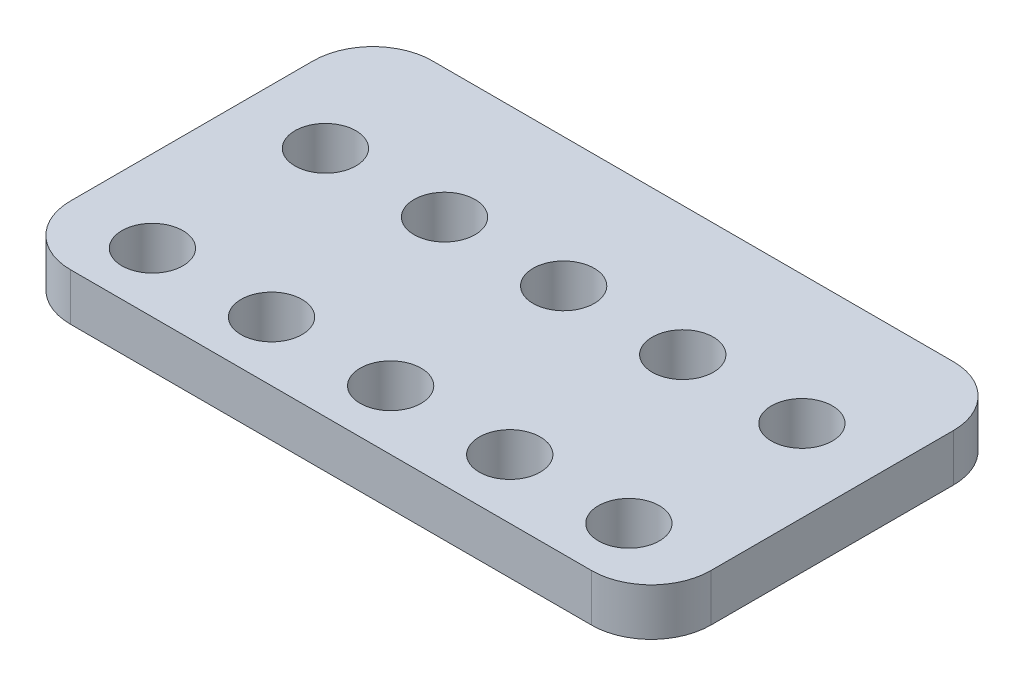
ISO-10303-21;
HEADER;
FILE_DESCRIPTION(('STEP AP214'),'2;1');
FILE_NAME('part.step','',(''),(''),'','','');
FILE_SCHEMA(('AUTOMOTIVE_DESIGN { 1 0 10303 214 1 1 1 1 }'));
ENDSEC;
DATA;
#1=APPLICATION_CONTEXT('core data for automotive mechanical design processes');
#2=APPLICATION_PROTOCOL_DEFINITION('international standard','automotive_design',2000,#1);
#3=PRODUCT_CONTEXT('',#1,'mechanical');
#4=PRODUCT('Part','Part','',(#3));
#5=PRODUCT_RELATED_PRODUCT_CATEGORY('part','',(#4));
#6=PRODUCT_DEFINITION_FORMATION('','',#4);
#7=PRODUCT_DEFINITION_CONTEXT('part definition',#1,'design');
#8=PRODUCT_DEFINITION('design','',#6,#7);
#9=PRODUCT_DEFINITION_SHAPE('','',#8);
#10=(LENGTH_UNIT() NAMED_UNIT(*) SI_UNIT(.MILLI.,.METRE.));
#11=(NAMED_UNIT(*) PLANE_ANGLE_UNIT() SI_UNIT($,.RADIAN.));
#12=(NAMED_UNIT(*) SI_UNIT($,.STERADIAN.) SOLID_ANGLE_UNIT());
#13=UNCERTAINTY_MEASURE_WITH_UNIT(LENGTH_MEASURE(1.E-05),#10,'distance_accuracy_value','');
#14=(GEOMETRIC_REPRESENTATION_CONTEXT(3) GLOBAL_UNCERTAINTY_ASSIGNED_CONTEXT((#13)) GLOBAL_UNIT_ASSIGNED_CONTEXT((#10,
#11,#12)) REPRESENTATION_CONTEXT('',''));
#15=CARTESIAN_POINT('',(0.,0.,0.));
#16=DIRECTION('',(0.,0.,1.));
#17=DIRECTION('',(1.,0.,0.));
#18=AXIS2_PLACEMENT_3D('',#15,#16,#17);
#19=CARTESIAN_POINT('',(0.,3.175,0.));
#20=DIRECTION('',(0.,1.,0.));
#21=DIRECTION('',(0.,0.,1.));
#22=AXIS2_PLACEMENT_3D('',#19,#20,#21);
#23=PLANE('',#22);
#24=CARTESIAN_POINT('',(7.99999999999999,3.175,-3.47));
#25=DIRECTION('',(0.,1.,0.));
#26=DIRECTION('',(0.,0.,1.));
#27=AXIS2_PLACEMENT_3D('',#24,#25,#26);
#28=CIRCLE('',#27,2.05);
#29=CARTESIAN_POINT('',(7.99999999999999,3.175,-1.42));
#30=VERTEX_POINT('',#29);
#31=EDGE_CURVE('E222',#30,#30,#28,.T.);
#32=ORIENTED_EDGE('',*,*,#31,.F.);
#33=EDGE_LOOP('',(#32));
#34=FACE_BOUND('',#33,.T.);
#35=CARTESIAN_POINT('',(-8.00000000000001,3.175,-3.47));
#36=DIRECTION('',(0.,1.,0.));
#37=DIRECTION('',(0.,0.,1.));
#38=AXIS2_PLACEMENT_3D('',#35,#36,#37);
#39=CIRCLE('',#38,2.05);
#40=CARTESIAN_POINT('',(-8.00000000000001,3.175,-1.42));
#41=VERTEX_POINT('',#40);
#42=EDGE_CURVE('E210',#41,#41,#39,.T.);
#43=ORIENTED_EDGE('',*,*,#42,.F.);
#44=EDGE_LOOP('',(#43));
#45=FACE_BOUND('',#44,.T.);
#46=CARTESIAN_POINT('',(16.,3.175,8.15));
#47=DIRECTION('',(0.,1.,0.));
#48=DIRECTION('',(0.,0.,1.));
#49=AXIS2_PLACEMENT_3D('',#46,#47,#48);
#50=CIRCLE('',#49,2.05);
#51=CARTESIAN_POINT('',(16.,3.175,10.2));
#52=VERTEX_POINT('',#51);
#53=EDGE_CURVE('E198',#52,#52,#50,.T.);
#54=ORIENTED_EDGE('',*,*,#53,.F.);
#55=EDGE_LOOP('',(#54));
#56=FACE_BOUND('',#55,.T.);
#57=CARTESIAN_POINT('',(0.,3.175,8.15));
#58=DIRECTION('',(0.,1.,0.));
#59=DIRECTION('',(0.,0.,1.));
#60=AXIS2_PLACEMENT_3D('',#57,#58,#59);
#61=CIRCLE('',#60,2.05);
#62=CARTESIAN_POINT('',(0.,3.175,10.2));
#63=VERTEX_POINT('',#62);
#64=EDGE_CURVE('E186',#63,#63,#61,.T.);
#65=ORIENTED_EDGE('',*,*,#64,.F.);
#66=EDGE_LOOP('',(#65));
#67=FACE_BOUND('',#66,.T.);
#68=CARTESIAN_POINT('',(-16.,3.175,8.15));
#69=DIRECTION('',(0.,1.,0.));
#70=DIRECTION('',(0.,0.,1.));
#71=AXIS2_PLACEMENT_3D('',#68,#69,#70);
#72=CIRCLE('',#71,2.05);
#73=CARTESIAN_POINT('',(-16.,3.175,10.2));
#74=VERTEX_POINT('',#73);
#75=EDGE_CURVE('E127',#74,#74,#72,.T.);
#76=ORIENTED_EDGE('',*,*,#75,.F.);
#77=EDGE_LOOP('',(#76));
#78=FACE_BOUND('',#77,.T.);
#79=DIRECTION('',(-1.,0.,0.));
#80=VECTOR('',#79,1.);
#81=CARTESIAN_POINT('',(21.5,3.175,-12.15));
#82=LINE('',#81,#80);
#83=CARTESIAN_POINT('',(17.5,3.175,-12.15));
#84=VERTEX_POINT('',#83);
#85=CARTESIAN_POINT('',(-17.5,3.175,-12.15));
#86=VERTEX_POINT('',#85);
#87=EDGE_CURVE('E136',#84,#86,#82,.T.);
#88=ORIENTED_EDGE('',*,*,#87,.T.);
#89=CARTESIAN_POINT('',(-17.5,3.175,-8.15));
#90=DIRECTION('',(0.,1.,0.));
#91=DIRECTION('',(0.,0.,1.));
#92=AXIS2_PLACEMENT_3D('',#89,#90,#91);
#93=CIRCLE('',#92,4.);
#94=CARTESIAN_POINT('',(-21.5,3.175,-8.15));
#95=VERTEX_POINT('',#94);
#96=EDGE_CURVE('E155',#86,#95,#93,.T.);
#97=ORIENTED_EDGE('',*,*,#96,.T.);
#98=DIRECTION('',(0.,0.,1.));
#99=VECTOR('',#98,1.);
#100=CARTESIAN_POINT('',(-21.5,3.175,12.15));
#101=LINE('',#100,#99);
#102=CARTESIAN_POINT('',(-21.5,3.175,8.15));
#103=VERTEX_POINT('',#102);
#104=EDGE_CURVE('E119',#95,#103,#101,.T.);
#105=ORIENTED_EDGE('',*,*,#104,.T.);
#106=CARTESIAN_POINT('',(-17.5,3.175,8.15));
#107=DIRECTION('',(0.,1.,0.));
#108=DIRECTION('',(0.,0.,1.));
#109=AXIS2_PLACEMENT_3D('',#106,#107,#108);
#110=CIRCLE('',#109,4.);
#111=CARTESIAN_POINT('',(-17.5,3.175,12.15));
#112=VERTEX_POINT('',#111);
#113=EDGE_CURVE('E150',#103,#112,#110,.T.);
#114=ORIENTED_EDGE('',*,*,#113,.T.);
#115=DIRECTION('',(1.,0.,0.));
#116=VECTOR('',#115,1.);
#117=CARTESIAN_POINT('',(21.5,3.175,12.15));
#118=LINE('',#117,#116);
#119=CARTESIAN_POINT('',(17.5,3.175,12.15));
#120=VERTEX_POINT('',#119);
#121=EDGE_CURVE('E166',#112,#120,#118,.T.);
#122=ORIENTED_EDGE('',*,*,#121,.T.);
#123=CARTESIAN_POINT('',(17.5,3.175,8.14999999999999));
#124=DIRECTION('',(0.,1.,0.));
#125=DIRECTION('',(0.,0.,1.));
#126=AXIS2_PLACEMENT_3D('',#123,#124,#125);
#127=CIRCLE('',#126,4.);
#128=CARTESIAN_POINT('',(21.5,3.175,8.14999999999999));
#129=VERTEX_POINT('',#128);
#130=EDGE_CURVE('E55',#120,#129,#127,.T.);
#131=ORIENTED_EDGE('',*,*,#130,.T.);
#132=DIRECTION('',(0.,0.,-1.));
#133=VECTOR('',#132,1.);
#134=CARTESIAN_POINT('',(21.5,3.175,12.15));
#135=LINE('',#134,#133);
#136=CARTESIAN_POINT('',(21.5,3.175,-8.15));
#137=VERTEX_POINT('',#136);
#138=EDGE_CURVE('E174',#129,#137,#135,.T.);
#139=ORIENTED_EDGE('',*,*,#138,.T.);
#140=CARTESIAN_POINT('',(17.5,3.175,-8.15));
#141=DIRECTION('',(0.,1.,0.));
#142=DIRECTION('',(0.,0.,1.));
#143=AXIS2_PLACEMENT_3D('',#140,#141,#142);
#144=CIRCLE('',#143,4.);
#145=EDGE_CURVE('E153',#137,#84,#144,.T.);
#146=ORIENTED_EDGE('',*,*,#145,.T.);
#147=EDGE_LOOP('',(#88,#97,#105,#114,#122,#131,#139,#146));
#148=FACE_BOUND('',#147,.T.);
#149=CARTESIAN_POINT('',(-8.00000000000001,3.175,8.15));
#150=DIRECTION('',(0.,1.,0.));
#151=DIRECTION('',(0.,0.,1.));
#152=AXIS2_PLACEMENT_3D('',#149,#150,#151);
#153=CIRCLE('',#152,2.05);
#154=CARTESIAN_POINT('',(-8.00000000000001,3.175,10.2));
#155=VERTEX_POINT('',#154);
#156=EDGE_CURVE('E181',#155,#155,#153,.T.);
#157=ORIENTED_EDGE('',*,*,#156,.F.);
#158=EDGE_LOOP('',(#157));
#159=FACE_BOUND('',#158,.T.);
#160=CARTESIAN_POINT('',(7.99999999999999,3.175,8.15));
#161=DIRECTION('',(0.,1.,0.));
#162=DIRECTION('',(0.,0.,1.));
#163=AXIS2_PLACEMENT_3D('',#160,#161,#162);
#164=CIRCLE('',#163,2.05);
#165=CARTESIAN_POINT('',(7.99999999999999,3.175,10.2));
#166=VERTEX_POINT('',#165);
#167=EDGE_CURVE('E192',#166,#166,#164,.T.);
#168=ORIENTED_EDGE('',*,*,#167,.F.);
#169=EDGE_LOOP('',(#168));
#170=FACE_BOUND('',#169,.T.);
#171=CARTESIAN_POINT('',(-16.,3.175,-3.47));
#172=DIRECTION('',(0.,1.,0.));
#173=DIRECTION('',(0.,0.,1.));
#174=AXIS2_PLACEMENT_3D('',#171,#172,#173);
#175=CIRCLE('',#174,2.05);
#176=CARTESIAN_POINT('',(-16.,3.175,-1.42));
#177=VERTEX_POINT('',#176);
#178=EDGE_CURVE('E204',#177,#177,#175,.T.);
#179=ORIENTED_EDGE('',*,*,#178,.F.);
#180=EDGE_LOOP('',(#179));
#181=FACE_BOUND('',#180,.T.);
#182=CARTESIAN_POINT('',(0.,3.175,-3.47));
#183=DIRECTION('',(0.,1.,0.));
#184=DIRECTION('',(0.,0.,1.));
#185=AXIS2_PLACEMENT_3D('',#182,#183,#184);
#186=CIRCLE('',#185,2.05);
#187=CARTESIAN_POINT('',(0.,3.175,-1.42));
#188=VERTEX_POINT('',#187);
#189=EDGE_CURVE('E216',#188,#188,#186,.T.);
#190=ORIENTED_EDGE('',*,*,#189,.F.);
#191=EDGE_LOOP('',(#190));
#192=FACE_BOUND('',#191,.T.);
#193=CARTESIAN_POINT('',(16.,3.175,-3.47));
#194=DIRECTION('',(0.,1.,0.));
#195=DIRECTION('',(0.,0.,1.));
#196=AXIS2_PLACEMENT_3D('',#193,#194,#195);
#197=CIRCLE('',#196,2.05);
#198=CARTESIAN_POINT('',(16.,3.175,-1.42));
#199=VERTEX_POINT('',#198);
#200=EDGE_CURVE('E228',#199,#199,#197,.T.);
#201=ORIENTED_EDGE('',*,*,#200,.F.);
#202=EDGE_LOOP('',(#201));
#203=FACE_BOUND('',#202,.T.);
#204=ADVANCED_FACE('F33',(#34,#45,#56,#67,#78,#148,#159,#170,#181,#192,#203),#23,.T.);
#205=CARTESIAN_POINT('',(0.,0.,0.));
#206=DIRECTION('',(0.,1.,0.));
#207=DIRECTION('',(0.,0.,1.));
#208=AXIS2_PLACEMENT_3D('',#205,#206,#207);
#209=PLANE('',#208);
#210=DIRECTION('',(0.,0.,1.));
#211=VECTOR('',#210,1.);
#212=CARTESIAN_POINT('',(-21.5,0.,12.15));
#213=LINE('',#212,#211);
#214=CARTESIAN_POINT('',(-21.5,0.,-8.15));
#215=VERTEX_POINT('',#214);
#216=CARTESIAN_POINT('',(-21.5,0.,8.15));
#217=VERTEX_POINT('',#216);
#218=EDGE_CURVE('E116',#215,#217,#213,.T.);
#219=ORIENTED_EDGE('',*,*,#218,.F.);
#220=CARTESIAN_POINT('',(-17.5,0.,-8.15));
#221=DIRECTION('',(0.,1.,0.));
#222=DIRECTION('',(0.,0.,1.));
#223=AXIS2_PLACEMENT_3D('',#220,#221,#222);
#224=CIRCLE('',#223,4.);
#225=CARTESIAN_POINT('',(-17.5,0.,-12.15));
#226=VERTEX_POINT('',#225);
#227=EDGE_CURVE('E99',#215,#226,#224,.F.);
#228=ORIENTED_EDGE('',*,*,#227,.T.);
#229=DIRECTION('',(-1.,0.,0.));
#230=VECTOR('',#229,1.);
#231=CARTESIAN_POINT('',(21.5,0.,-12.15));
#232=LINE('',#231,#230);
#233=CARTESIAN_POINT('',(17.5,0.,-12.15));
#234=VERTEX_POINT('',#233);
#235=EDGE_CURVE('E140',#234,#226,#232,.T.);
#236=ORIENTED_EDGE('',*,*,#235,.F.);
#237=CARTESIAN_POINT('',(17.5,0.,-8.15));
#238=DIRECTION('',(0.,1.,0.));
#239=DIRECTION('',(0.,0.,1.));
#240=AXIS2_PLACEMENT_3D('',#237,#238,#239);
#241=CIRCLE('',#240,4.);
#242=CARTESIAN_POINT('',(21.5,0.,-8.15));
#243=VERTEX_POINT('',#242);
#244=EDGE_CURVE('E110',#234,#243,#241,.F.);
#245=ORIENTED_EDGE('',*,*,#244,.T.);
#246=DIRECTION('',(0.,0.,-1.));
#247=VECTOR('',#246,1.);
#248=CARTESIAN_POINT('',(21.5,0.,12.15));
#249=LINE('',#248,#247);
#250=CARTESIAN_POINT('',(21.5,0.,8.14999999999999));
#251=VERTEX_POINT('',#250);
#252=EDGE_CURVE('E130',#251,#243,#249,.T.);
#253=ORIENTED_EDGE('',*,*,#252,.F.);
#254=CARTESIAN_POINT('',(17.5,0.,8.14999999999999));
#255=DIRECTION('',(0.,1.,0.));
#256=DIRECTION('',(0.,0.,1.));
#257=AXIS2_PLACEMENT_3D('',#254,#255,#256);
#258=CIRCLE('',#257,4.);
#259=CARTESIAN_POINT('',(17.5,0.,12.15));
#260=VERTEX_POINT('',#259);
#261=EDGE_CURVE('E144',#251,#260,#258,.F.);
#262=ORIENTED_EDGE('',*,*,#261,.T.);
#263=DIRECTION('',(1.,0.,0.));
#264=VECTOR('',#263,1.);
#265=CARTESIAN_POINT('',(21.5,0.,12.15));
#266=LINE('',#265,#264);
#267=CARTESIAN_POINT('',(-17.5,0.,12.15));
#268=VERTEX_POINT('',#267);
#269=EDGE_CURVE('E126',#268,#260,#266,.T.);
#270=ORIENTED_EDGE('',*,*,#269,.F.);
#271=CARTESIAN_POINT('',(-17.5,0.,8.15));
#272=DIRECTION('',(0.,1.,0.));
#273=DIRECTION('',(0.,0.,1.));
#274=AXIS2_PLACEMENT_3D('',#271,#272,#273);
#275=CIRCLE('',#274,4.);
#276=EDGE_CURVE('E120',#268,#217,#275,.F.);
#277=ORIENTED_EDGE('',*,*,#276,.T.);
#278=EDGE_LOOP('',(#219,#228,#236,#245,#253,#262,#270,#277));
#279=FACE_BOUND('',#278,.T.);
#280=CARTESIAN_POINT('',(-16.,0.,8.15));
#281=DIRECTION('',(0.,1.,0.));
#282=DIRECTION('',(0.,0.,1.));
#283=AXIS2_PLACEMENT_3D('',#280,#281,#282);
#284=CIRCLE('',#283,2.05);
#285=CARTESIAN_POINT('',(-16.,0.,10.2));
#286=VERTEX_POINT('',#285);
#287=EDGE_CURVE('E133',#286,#286,#284,.T.);
#288=ORIENTED_EDGE('',*,*,#287,.T.);
#289=EDGE_LOOP('',(#288));
#290=FACE_BOUND('',#289,.T.);
#291=CARTESIAN_POINT('',(-8.00000000000001,0.,8.15));
#292=DIRECTION('',(0.,1.,0.));
#293=DIRECTION('',(0.,0.,1.));
#294=AXIS2_PLACEMENT_3D('',#291,#292,#293);
#295=CIRCLE('',#294,2.05);
#296=CARTESIAN_POINT('',(-8.00000000000001,0.,10.2));
#297=VERTEX_POINT('',#296);
#298=EDGE_CURVE('E183',#297,#297,#295,.T.);
#299=ORIENTED_EDGE('',*,*,#298,.T.);
#300=EDGE_LOOP('',(#299));
#301=FACE_BOUND('',#300,.T.);
#302=CARTESIAN_POINT('',(0.,0.,8.15));
#303=DIRECTION('',(0.,1.,0.));
#304=DIRECTION('',(0.,0.,1.));
#305=AXIS2_PLACEMENT_3D('',#302,#303,#304);
#306=CIRCLE('',#305,2.05);
#307=CARTESIAN_POINT('',(0.,0.,10.2));
#308=VERTEX_POINT('',#307);
#309=EDGE_CURVE('E189',#308,#308,#306,.T.);
#310=ORIENTED_EDGE('',*,*,#309,.T.);
#311=EDGE_LOOP('',(#310));
#312=FACE_BOUND('',#311,.T.);
#313=CARTESIAN_POINT('',(7.99999999999999,0.,8.15));
#314=DIRECTION('',(0.,1.,0.));
#315=DIRECTION('',(0.,0.,1.));
#316=AXIS2_PLACEMENT_3D('',#313,#314,#315);
#317=CIRCLE('',#316,2.05);
#318=CARTESIAN_POINT('',(7.99999999999999,0.,10.2));
#319=VERTEX_POINT('',#318);
#320=EDGE_CURVE('E195',#319,#319,#317,.T.);
#321=ORIENTED_EDGE('',*,*,#320,.T.);
#322=EDGE_LOOP('',(#321));
#323=FACE_BOUND('',#322,.T.);
#324=CARTESIAN_POINT('',(16.,0.,8.15));
#325=DIRECTION('',(0.,1.,0.));
#326=DIRECTION('',(0.,0.,1.));
#327=AXIS2_PLACEMENT_3D('',#324,#325,#326);
#328=CIRCLE('',#327,2.05);
#329=CARTESIAN_POINT('',(16.,0.,10.2));
#330=VERTEX_POINT('',#329);
#331=EDGE_CURVE('E201',#330,#330,#328,.T.);
#332=ORIENTED_EDGE('',*,*,#331,.T.);
#333=EDGE_LOOP('',(#332));
#334=FACE_BOUND('',#333,.T.);
#335=CARTESIAN_POINT('',(-16.,0.,-3.47));
#336=DIRECTION('',(0.,1.,0.));
#337=DIRECTION('',(0.,0.,1.));
#338=AXIS2_PLACEMENT_3D('',#335,#336,#337);
#339=CIRCLE('',#338,2.05);
#340=CARTESIAN_POINT('',(-16.,0.,-1.42));
#341=VERTEX_POINT('',#340);
#342=EDGE_CURVE('E207',#341,#341,#339,.T.);
#343=ORIENTED_EDGE('',*,*,#342,.T.);
#344=EDGE_LOOP('',(#343));
#345=FACE_BOUND('',#344,.T.);
#346=CARTESIAN_POINT('',(-8.00000000000001,0.,-3.47));
#347=DIRECTION('',(0.,1.,0.));
#348=DIRECTION('',(0.,0.,1.));
#349=AXIS2_PLACEMENT_3D('',#346,#347,#348);
#350=CIRCLE('',#349,2.05);
#351=CARTESIAN_POINT('',(-8.00000000000001,0.,-1.42));
#352=VERTEX_POINT('',#351);
#353=EDGE_CURVE('E213',#352,#352,#350,.T.);
#354=ORIENTED_EDGE('',*,*,#353,.T.);
#355=EDGE_LOOP('',(#354));
#356=FACE_BOUND('',#355,.T.);
#357=CARTESIAN_POINT('',(0.,0.,-3.47));
#358=DIRECTION('',(0.,1.,0.));
#359=DIRECTION('',(0.,0.,1.));
#360=AXIS2_PLACEMENT_3D('',#357,#358,#359);
#361=CIRCLE('',#360,2.05);
#362=CARTESIAN_POINT('',(0.,0.,-1.42));
#363=VERTEX_POINT('',#362);
#364=EDGE_CURVE('E219',#363,#363,#361,.T.);
#365=ORIENTED_EDGE('',*,*,#364,.T.);
#366=EDGE_LOOP('',(#365));
#367=FACE_BOUND('',#366,.T.);
#368=CARTESIAN_POINT('',(7.99999999999999,0.,-3.47));
#369=DIRECTION('',(0.,1.,0.));
#370=DIRECTION('',(0.,0.,1.));
#371=AXIS2_PLACEMENT_3D('',#368,#369,#370);
#372=CIRCLE('',#371,2.05);
#373=CARTESIAN_POINT('',(7.99999999999999,0.,-1.42));
#374=VERTEX_POINT('',#373);
#375=EDGE_CURVE('E225',#374,#374,#372,.T.);
#376=ORIENTED_EDGE('',*,*,#375,.T.);
#377=EDGE_LOOP('',(#376));
#378=FACE_BOUND('',#377,.T.);
#379=CARTESIAN_POINT('',(16.,0.,-3.47));
#380=DIRECTION('',(0.,1.,0.));
#381=DIRECTION('',(0.,0.,1.));
#382=AXIS2_PLACEMENT_3D('',#379,#380,#381);
#383=CIRCLE('',#382,2.05);
#384=CARTESIAN_POINT('',(16.,0.,-1.42));
#385=VERTEX_POINT('',#384);
#386=EDGE_CURVE('E231',#385,#385,#383,.T.);
#387=ORIENTED_EDGE('',*,*,#386,.T.);
#388=EDGE_LOOP('',(#387));
#389=FACE_BOUND('',#388,.T.);
#390=ADVANCED_FACE('F123',(#279,#290,#301,#312,#323,#334,#345,#356,#367,#378,#389),#209,.F.);
#391=CARTESIAN_POINT('',(-21.5,3.175,12.15));
#392=DIRECTION('',(1.,0.,0.));
#393=DIRECTION('',(0.,0.,-1.));
#394=AXIS2_PLACEMENT_3D('',#391,#392,#393);
#395=PLANE('',#394);
#396=ORIENTED_EDGE('',*,*,#104,.F.);
#397=DIRECTION('',(0.,-1.,0.));
#398=VECTOR('',#397,1.);
#399=CARTESIAN_POINT('',(-21.5,3.175,-8.15));
#400=LINE('',#399,#398);
#401=EDGE_CURVE('E103',#95,#215,#400,.T.);
#402=ORIENTED_EDGE('',*,*,#401,.T.);
#403=ORIENTED_EDGE('',*,*,#218,.T.);
#404=DIRECTION('',(0.,-1.,0.));
#405=VECTOR('',#404,1.);
#406=CARTESIAN_POINT('',(-21.5,3.175,8.15));
#407=LINE('',#406,#405);
#408=EDGE_CURVE('E121',#217,#103,#407,.F.);
#409=ORIENTED_EDGE('',*,*,#408,.T.);
#410=EDGE_LOOP('',(#396,#402,#403,#409));
#411=FACE_BOUND('',#410,.T.);
#412=ADVANCED_FACE('F115',(#411),#395,.F.);
#413=CARTESIAN_POINT('',(21.5,3.175,12.15));
#414=DIRECTION('',(0.,0.,-1.));
#415=DIRECTION('',(-1.,0.,0.));
#416=AXIS2_PLACEMENT_3D('',#413,#414,#415);
#417=PLANE('',#416);
#418=ORIENTED_EDGE('',*,*,#269,.T.);
#419=DIRECTION('',(0.,-1.,0.));
#420=VECTOR('',#419,1.);
#421=CARTESIAN_POINT('',(17.5,3.175,12.15));
#422=LINE('',#421,#420);
#423=EDGE_CURVE('E11',#260,#120,#422,.F.);
#424=ORIENTED_EDGE('',*,*,#423,.T.);
#425=ORIENTED_EDGE('',*,*,#121,.F.);
#426=DIRECTION('',(0.,-1.,0.));
#427=VECTOR('',#426,1.);
#428=CARTESIAN_POINT('',(-17.5,3.175,12.15));
#429=LINE('',#428,#427);
#430=EDGE_CURVE('E41',#112,#268,#429,.T.);
#431=ORIENTED_EDGE('',*,*,#430,.T.);
#432=EDGE_LOOP('',(#418,#424,#425,#431));
#433=FACE_BOUND('',#432,.T.);
#434=ADVANCED_FACE('F164',(#433),#417,.F.);
#435=CARTESIAN_POINT('',(21.5,3.175,12.15));
#436=DIRECTION('',(-1.,0.,0.));
#437=DIRECTION('',(0.,0.,1.));
#438=AXIS2_PLACEMENT_3D('',#435,#436,#437);
#439=PLANE('',#438);
#440=ORIENTED_EDGE('',*,*,#252,.T.);
#441=DIRECTION('',(0.,-1.,0.));
#442=VECTOR('',#441,1.);
#443=CARTESIAN_POINT('',(21.5,3.175,-8.15));
#444=LINE('',#443,#442);
#445=EDGE_CURVE('E48',#243,#137,#444,.F.);
#446=ORIENTED_EDGE('',*,*,#445,.T.);
#447=ORIENTED_EDGE('',*,*,#138,.F.);
#448=DIRECTION('',(0.,-1.,0.));
#449=VECTOR('',#448,1.);
#450=CARTESIAN_POINT('',(21.5,3.175,8.14999999999999));
#451=LINE('',#450,#449);
#452=EDGE_CURVE('E157',#129,#251,#451,.T.);
#453=ORIENTED_EDGE('',*,*,#452,.T.);
#454=EDGE_LOOP('',(#440,#446,#447,#453));
#455=FACE_BOUND('',#454,.T.);
#456=ADVANCED_FACE('F173',(#455),#439,.F.);
#457=CARTESIAN_POINT('',(21.5,3.175,-12.15));
#458=DIRECTION('',(0.,0.,1.));
#459=DIRECTION('',(1.,0.,0.));
#460=AXIS2_PLACEMENT_3D('',#457,#458,#459);
#461=PLANE('',#460);
#462=ORIENTED_EDGE('',*,*,#235,.T.);
#463=DIRECTION('',(0.,-1.,0.));
#464=VECTOR('',#463,1.);
#465=CARTESIAN_POINT('',(-17.5,3.175,-12.15));
#466=LINE('',#465,#464);
#467=EDGE_CURVE('E104',#226,#86,#466,.F.);
#468=ORIENTED_EDGE('',*,*,#467,.T.);
#469=ORIENTED_EDGE('',*,*,#87,.F.);
#470=DIRECTION('',(0.,-1.,0.));
#471=VECTOR('',#470,1.);
#472=CARTESIAN_POINT('',(17.5,3.175,-12.15));
#473=LINE('',#472,#471);
#474=EDGE_CURVE('E109',#84,#234,#473,.T.);
#475=ORIENTED_EDGE('',*,*,#474,.T.);
#476=EDGE_LOOP('',(#462,#468,#469,#475));
#477=FACE_BOUND('',#476,.T.);
#478=ADVANCED_FACE('F253',(#477),#461,.F.);
#479=CARTESIAN_POINT('',(-16.,3.175,8.15));
#480=DIRECTION('',(0.,-1.,0.));
#481=DIRECTION('',(0.,0.,-1.));
#482=AXIS2_PLACEMENT_3D('',#479,#480,#481);
#483=CYLINDRICAL_SURFACE('',#482,2.05);
#484=ORIENTED_EDGE('',*,*,#75,.T.);
#485=EDGE_LOOP('',(#484));
#486=FACE_BOUND('',#485,.T.);
#487=ORIENTED_EDGE('',*,*,#287,.F.);
#488=EDGE_LOOP('',(#487));
#489=FACE_BOUND('',#488,.T.);
#490=ADVANCED_FACE('F250',(#486,#489),#483,.F.);
#491=CARTESIAN_POINT('',(-8.00000000000001,3.175,8.15));
#492=DIRECTION('',(0.,-1.,0.));
#493=DIRECTION('',(0.,0.,-1.));
#494=AXIS2_PLACEMENT_3D('',#491,#492,#493);
#495=CYLINDRICAL_SURFACE('',#494,2.05);
#496=ORIENTED_EDGE('',*,*,#156,.T.);
#497=EDGE_LOOP('',(#496));
#498=FACE_BOUND('',#497,.T.);
#499=ORIENTED_EDGE('',*,*,#298,.F.);
#500=EDGE_LOOP('',(#499));
#501=FACE_BOUND('',#500,.T.);
#502=ADVANCED_FACE('F322',(#498,#501),#495,.F.);
#503=CARTESIAN_POINT('',(0.,3.175,8.15));
#504=DIRECTION('',(0.,-1.,0.));
#505=DIRECTION('',(0.,0.,-1.));
#506=AXIS2_PLACEMENT_3D('',#503,#504,#505);
#507=CYLINDRICAL_SURFACE('',#506,2.05);
#508=ORIENTED_EDGE('',*,*,#64,.T.);
#509=EDGE_LOOP('',(#508));
#510=FACE_BOUND('',#509,.T.);
#511=ORIENTED_EDGE('',*,*,#309,.F.);
#512=EDGE_LOOP('',(#511));
#513=FACE_BOUND('',#512,.T.);
#514=ADVANCED_FACE('F319',(#510,#513),#507,.F.);
#515=CARTESIAN_POINT('',(7.99999999999999,3.175,8.15));
#516=DIRECTION('',(0.,-1.,0.));
#517=DIRECTION('',(0.,0.,-1.));
#518=AXIS2_PLACEMENT_3D('',#515,#516,#517);
#519=CYLINDRICAL_SURFACE('',#518,2.05);
#520=ORIENTED_EDGE('',*,*,#167,.T.);
#521=EDGE_LOOP('',(#520));
#522=FACE_BOUND('',#521,.T.);
#523=ORIENTED_EDGE('',*,*,#320,.F.);
#524=EDGE_LOOP('',(#523));
#525=FACE_BOUND('',#524,.T.);
#526=ADVANCED_FACE('F315',(#522,#525),#519,.F.);
#527=CARTESIAN_POINT('',(16.,3.175,8.15));
#528=DIRECTION('',(0.,-1.,0.));
#529=DIRECTION('',(0.,0.,-1.));
#530=AXIS2_PLACEMENT_3D('',#527,#528,#529);
#531=CYLINDRICAL_SURFACE('',#530,2.05);
#532=ORIENTED_EDGE('',*,*,#53,.T.);
#533=EDGE_LOOP('',(#532));
#534=FACE_BOUND('',#533,.T.);
#535=ORIENTED_EDGE('',*,*,#331,.F.);
#536=EDGE_LOOP('',(#535));
#537=FACE_BOUND('',#536,.T.);
#538=ADVANCED_FACE('F311',(#534,#537),#531,.F.);
#539=CARTESIAN_POINT('',(-16.,3.175,-3.47));
#540=DIRECTION('',(0.,-1.,0.));
#541=DIRECTION('',(0.,0.,-1.));
#542=AXIS2_PLACEMENT_3D('',#539,#540,#541);
#543=CYLINDRICAL_SURFACE('',#542,2.05);
#544=ORIENTED_EDGE('',*,*,#178,.T.);
#545=EDGE_LOOP('',(#544));
#546=FACE_BOUND('',#545,.T.);
#547=ORIENTED_EDGE('',*,*,#342,.F.);
#548=EDGE_LOOP('',(#547));
#549=FACE_BOUND('',#548,.T.);
#550=ADVANCED_FACE('F307',(#546,#549),#543,.F.);
#551=CARTESIAN_POINT('',(-8.00000000000001,3.175,-3.47));
#552=DIRECTION('',(0.,-1.,0.));
#553=DIRECTION('',(0.,0.,-1.));
#554=AXIS2_PLACEMENT_3D('',#551,#552,#553);
#555=CYLINDRICAL_SURFACE('',#554,2.05);
#556=ORIENTED_EDGE('',*,*,#42,.T.);
#557=EDGE_LOOP('',(#556));
#558=FACE_BOUND('',#557,.T.);
#559=ORIENTED_EDGE('',*,*,#353,.F.);
#560=EDGE_LOOP('',(#559));
#561=FACE_BOUND('',#560,.T.);
#562=ADVANCED_FACE('F289',(#558,#561),#555,.F.);
#563=CARTESIAN_POINT('',(0.,3.175,-3.47));
#564=DIRECTION('',(0.,-1.,0.));
#565=DIRECTION('',(0.,0.,-1.));
#566=AXIS2_PLACEMENT_3D('',#563,#564,#565);
#567=CYLINDRICAL_SURFACE('',#566,2.05);
#568=ORIENTED_EDGE('',*,*,#189,.T.);
#569=EDGE_LOOP('',(#568));
#570=FACE_BOUND('',#569,.T.);
#571=ORIENTED_EDGE('',*,*,#364,.F.);
#572=EDGE_LOOP('',(#571));
#573=FACE_BOUND('',#572,.T.);
#574=ADVANCED_FACE('F285',(#570,#573),#567,.F.);
#575=CARTESIAN_POINT('',(7.99999999999999,3.175,-3.47));
#576=DIRECTION('',(0.,-1.,0.));
#577=DIRECTION('',(0.,0.,-1.));
#578=AXIS2_PLACEMENT_3D('',#575,#576,#577);
#579=CYLINDRICAL_SURFACE('',#578,2.05);
#580=ORIENTED_EDGE('',*,*,#31,.T.);
#581=EDGE_LOOP('',(#580));
#582=FACE_BOUND('',#581,.T.);
#583=ORIENTED_EDGE('',*,*,#375,.F.);
#584=EDGE_LOOP('',(#583));
#585=FACE_BOUND('',#584,.T.);
#586=ADVANCED_FACE('F288',(#582,#585),#579,.F.);
#587=CARTESIAN_POINT('',(16.,3.175,-3.47));
#588=DIRECTION('',(0.,-1.,0.));
#589=DIRECTION('',(0.,0.,-1.));
#590=AXIS2_PLACEMENT_3D('',#587,#588,#589);
#591=CYLINDRICAL_SURFACE('',#590,2.05);
#592=ORIENTED_EDGE('',*,*,#200,.T.);
#593=EDGE_LOOP('',(#592));
#594=FACE_BOUND('',#593,.T.);
#595=ORIENTED_EDGE('',*,*,#386,.F.);
#596=EDGE_LOOP('',(#595));
#597=FACE_BOUND('',#596,.T.);
#598=ADVANCED_FACE('F237',(#594,#597),#591,.F.);
#599=CARTESIAN_POINT('',(-17.5,3.175,-8.15));
#600=DIRECTION('',(0.,-1.,0.));
#601=DIRECTION('',(0.,0.,-1.));
#602=AXIS2_PLACEMENT_3D('',#599,#600,#601);
#603=CYLINDRICAL_SURFACE('',#602,4.);
#604=ORIENTED_EDGE('',*,*,#96,.F.);
#605=ORIENTED_EDGE('',*,*,#467,.F.);
#606=ORIENTED_EDGE('',*,*,#227,.F.);
#607=ORIENTED_EDGE('',*,*,#401,.F.);
#608=EDGE_LOOP('',(#604,#605,#606,#607));
#609=FACE_BOUND('',#608,.T.);
#610=ADVANCED_FACE('F102',(#609),#603,.T.);
#611=CARTESIAN_POINT('',(17.5,3.175,-8.15));
#612=DIRECTION('',(0.,-1.,0.));
#613=DIRECTION('',(0.,0.,-1.));
#614=AXIS2_PLACEMENT_3D('',#611,#612,#613);
#615=CYLINDRICAL_SURFACE('',#614,4.);
#616=ORIENTED_EDGE('',*,*,#145,.F.);
#617=ORIENTED_EDGE('',*,*,#445,.F.);
#618=ORIENTED_EDGE('',*,*,#244,.F.);
#619=ORIENTED_EDGE('',*,*,#474,.F.);
#620=EDGE_LOOP('',(#616,#617,#618,#619));
#621=FACE_BOUND('',#620,.T.);
#622=ADVANCED_FACE('F265',(#621),#615,.T.);
#623=CARTESIAN_POINT('',(17.5,3.175,8.14999999999999));
#624=DIRECTION('',(0.,-1.,0.));
#625=DIRECTION('',(0.,0.,-1.));
#626=AXIS2_PLACEMENT_3D('',#623,#624,#625);
#627=CYLINDRICAL_SURFACE('',#626,4.);
#628=ORIENTED_EDGE('',*,*,#130,.F.);
#629=ORIENTED_EDGE('',*,*,#423,.F.);
#630=ORIENTED_EDGE('',*,*,#261,.F.);
#631=ORIENTED_EDGE('',*,*,#452,.F.);
#632=EDGE_LOOP('',(#628,#629,#630,#631));
#633=FACE_BOUND('',#632,.T.);
#634=ADVANCED_FACE('F172',(#633),#627,.T.);
#635=CARTESIAN_POINT('',(-17.5,3.175,8.15));
#636=DIRECTION('',(0.,-1.,0.));
#637=DIRECTION('',(0.,0.,-1.));
#638=AXIS2_PLACEMENT_3D('',#635,#636,#637);
#639=CYLINDRICAL_SURFACE('',#638,4.);
#640=ORIENTED_EDGE('',*,*,#113,.F.);
#641=ORIENTED_EDGE('',*,*,#408,.F.);
#642=ORIENTED_EDGE('',*,*,#276,.F.);
#643=ORIENTED_EDGE('',*,*,#430,.F.);
#644=EDGE_LOOP('',(#640,#641,#642,#643));
#645=FACE_BOUND('',#644,.T.);
#646=ADVANCED_FACE('F35',(#645),#639,.T.);
#647=CLOSED_SHELL('',(#204,#390,#412,#434,#456,#478,#490,#502,#514,#526,#538,#550,#562,#574,
#586,#598,#610,#622,#634,#646));
#648=MANIFOLD_SOLID_BREP('B2',#647);
#649=ADVANCED_BREP_SHAPE_REPRESENTATION('',(#18,#648),#14);
#650=SHAPE_DEFINITION_REPRESENTATION(#9,#649);
ENDSEC;
END-ISO-10303-21;
